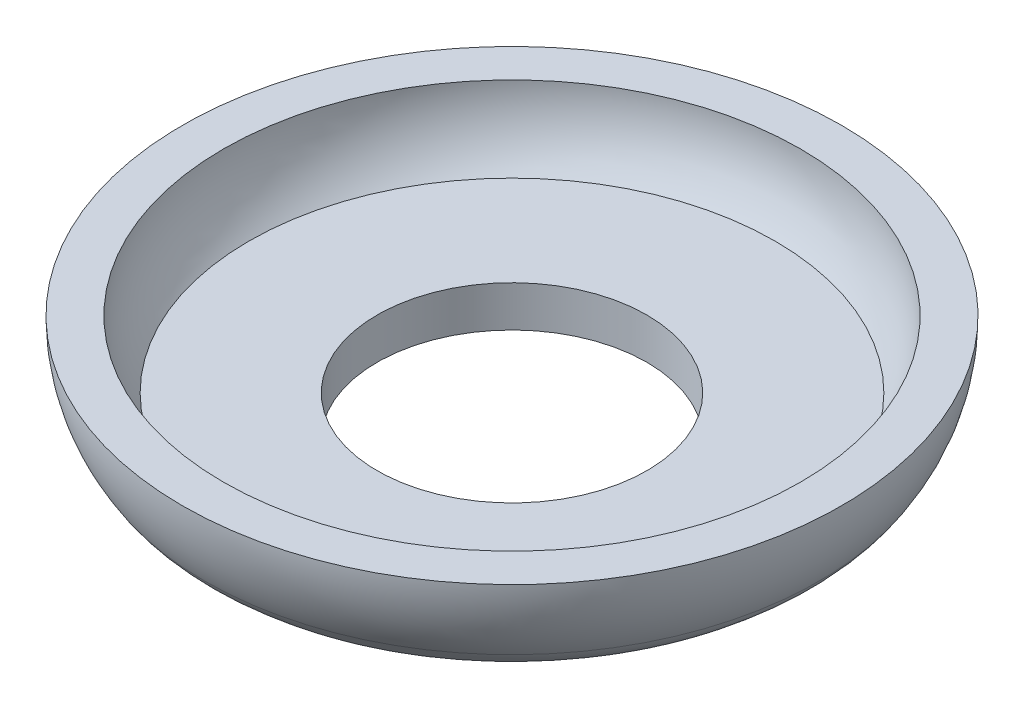
ISO-10303-21;
HEADER;
FILE_DESCRIPTION(('STEP AP214'),'2;1');
FILE_NAME('part.step','',(''),(''),'','','');
FILE_SCHEMA(('AUTOMOTIVE_DESIGN { 1 0 10303 214 1 1 1 1 }'));
ENDSEC;
DATA;
#1=APPLICATION_CONTEXT('core data for automotive mechanical design processes');
#2=APPLICATION_PROTOCOL_DEFINITION('international standard','automotive_design',2000,#1);
#3=PRODUCT_CONTEXT('',#1,'mechanical');
#4=PRODUCT('Part','Part','',(#3));
#5=PRODUCT_RELATED_PRODUCT_CATEGORY('part','',(#4));
#6=PRODUCT_DEFINITION_FORMATION('','',#4);
#7=PRODUCT_DEFINITION_CONTEXT('part definition',#1,'design');
#8=PRODUCT_DEFINITION('design','',#6,#7);
#9=PRODUCT_DEFINITION_SHAPE('','',#8);
#10=(LENGTH_UNIT() NAMED_UNIT(*) SI_UNIT(.MILLI.,.METRE.));
#11=(NAMED_UNIT(*) PLANE_ANGLE_UNIT() SI_UNIT($,.RADIAN.));
#12=(NAMED_UNIT(*) SI_UNIT($,.STERADIAN.) SOLID_ANGLE_UNIT());
#13=UNCERTAINTY_MEASURE_WITH_UNIT(LENGTH_MEASURE(1.E-05),#10,'distance_accuracy_value','');
#14=(GEOMETRIC_REPRESENTATION_CONTEXT(3) GLOBAL_UNCERTAINTY_ASSIGNED_CONTEXT((#13)) GLOBAL_UNIT_ASSIGNED_CONTEXT((#10,
#11,#12)) REPRESENTATION_CONTEXT('',''));
#15=CARTESIAN_POINT('',(0.,0.,0.));
#16=DIRECTION('',(0.,0.,1.));
#17=DIRECTION('',(1.,0.,0.));
#18=AXIS2_PLACEMENT_3D('',#15,#16,#17);
#19=CARTESIAN_POINT('',(0.,0.,0.));
#20=DIRECTION('',(0.,-1.,0.));
#21=DIRECTION('',(0.,0.,-1.));
#22=AXIS2_PLACEMENT_3D('',#19,#20,#21);
#23=CYLINDRICAL_SURFACE('',#22,5.0165);
#24=CARTESIAN_POINT('',(0.,0.,0.));
#25=DIRECTION('',(0.,-1.,0.));
#26=DIRECTION('',(0.,0.,-1.));
#27=AXIS2_PLACEMENT_3D('',#24,#25,#26);
#28=CIRCLE('',#27,5.0165);
#29=CARTESIAN_POINT('',(0.,0.,-5.0165));
#30=VERTEX_POINT('',#29);
#31=EDGE_CURVE('E10',#30,#30,#28,.T.);
#32=ORIENTED_EDGE('',*,*,#31,.T.);
#33=EDGE_LOOP('',(#32));
#34=FACE_BOUND('',#33,.T.);
#35=CARTESIAN_POINT('',(0.,1.524,0.));
#36=DIRECTION('',(0.,-1.,0.));
#37=DIRECTION('',(0.,0.,-1.));
#38=AXIS2_PLACEMENT_3D('',#35,#36,#37);
#39=CIRCLE('',#38,5.0165);
#40=CARTESIAN_POINT('',(0.,1.524,-5.0165));
#41=VERTEX_POINT('',#40);
#42=EDGE_CURVE('E57',#41,#41,#39,.T.);
#43=ORIENTED_EDGE('',*,*,#42,.F.);
#44=EDGE_LOOP('',(#43));
#45=FACE_BOUND('',#44,.T.);
#46=ADVANCED_FACE('F32',(#34,#45),#23,.F.);
#47=CARTESIAN_POINT('',(5.0165,0.,0.));
#48=DIRECTION('',(0.,-1.,0.));
#49=DIRECTION('',(0.,0.,-1.));
#50=AXIS2_PLACEMENT_3D('',#47,#48,#49);
#51=PLANE('',#50);
#52=CARTESIAN_POINT('',(0.,0.,0.));
#53=DIRECTION('',(0.,-1.,0.));
#54=DIRECTION('',(0.,0.,-1.));
#55=AXIS2_PLACEMENT_3D('',#52,#53,#54);
#56=CIRCLE('',#55,9.28063100395453);
#57=CARTESIAN_POINT('',(0.,0.,-9.28063100395453));
#58=VERTEX_POINT('',#57);
#59=EDGE_CURVE('E38',#58,#58,#56,.T.);
#60=ORIENTED_EDGE('',*,*,#59,.T.);
#61=EDGE_LOOP('',(#60));
#62=FACE_BOUND('',#61,.T.);
#63=ORIENTED_EDGE('',*,*,#31,.F.);
#64=EDGE_LOOP('',(#63));
#65=FACE_BOUND('',#64,.T.);
#66=ADVANCED_FACE('F65',(#62,#65),#51,.T.);
#67=CARTESIAN_POINT('',(0.,2.54,0.));
#68=DIRECTION('',(0.,-1.,0.));
#69=DIRECTION('',(0.,0.,-1.));
#70=AXIS2_PLACEMENT_3D('',#67,#68,#69);
#71=TOROIDAL_SURFACE('',#70,9.28063100395453,2.54);
#72=CARTESIAN_POINT('',(0.,1.16064230205049,0.));
#73=DIRECTION('',(0.,-1.,0.));
#74=DIRECTION('',(0.,0.,-1.));
#75=AXIS2_PLACEMENT_3D('',#72,#73,#74);
#76=CIRCLE('',#75,11.4134630041616);
#77=CARTESIAN_POINT('',(0.,1.16064230205049,-11.4134630041616));
#78=VERTEX_POINT('',#77);
#79=EDGE_CURVE('E42',#78,#78,#76,.T.);
#80=ORIENTED_EDGE('',*,*,#79,.T.);
#81=EDGE_LOOP('',(#80));
#82=FACE_BOUND('',#81,.T.);
#83=ORIENTED_EDGE('',*,*,#59,.F.);
#84=EDGE_LOOP('',(#83));
#85=FACE_BOUND('',#84,.T.);
#86=ADVANCED_FACE('F69',(#82,#85),#71,.T.);
#87=CARTESIAN_POINT('',(0.,4.0132,0.));
#88=DIRECTION('',(0.,-1.,0.));
#89=DIRECTION('',(0.,0.,-1.));
#90=AXIS2_PLACEMENT_3D('',#87,#88,#89);
#91=TOROIDAL_SURFACE('',#90,7.00269533333334,5.25280466666666);
#92=CARTESIAN_POINT('',(0.,4.0132,0.));
#93=DIRECTION('',(0.,-1.,0.));
#94=DIRECTION('',(0.,0.,-1.));
#95=AXIS2_PLACEMENT_3D('',#92,#93,#94);
#96=CIRCLE('',#95,12.2555);
#97=CARTESIAN_POINT('',(0.,4.0132,-12.2555));
#98=VERTEX_POINT('',#97);
#99=EDGE_CURVE('E46',#98,#98,#96,.T.);
#100=ORIENTED_EDGE('',*,*,#99,.T.);
#101=EDGE_LOOP('',(#100));
#102=FACE_BOUND('',#101,.T.);
#103=ORIENTED_EDGE('',*,*,#79,.F.);
#104=EDGE_LOOP('',(#103));
#105=FACE_BOUND('',#104,.T.);
#106=ADVANCED_FACE('F73',(#102,#105),#91,.T.);
#107=CARTESIAN_POINT('',(10.7315,4.0132,0.));
#108=DIRECTION('',(0.,1.,0.));
#109=DIRECTION('',(0.,0.,1.));
#110=AXIS2_PLACEMENT_3D('',#107,#108,#109);
#111=PLANE('',#110);
#112=CARTESIAN_POINT('',(0.,4.0132,0.));
#113=DIRECTION('',(0.,-1.,0.));
#114=DIRECTION('',(0.,0.,-1.));
#115=AXIS2_PLACEMENT_3D('',#112,#113,#114);
#116=CIRCLE('',#115,10.7315);
#117=CARTESIAN_POINT('',(0.,4.0132,-10.7315));
#118=VERTEX_POINT('',#117);
#119=EDGE_CURVE('E51',#118,#118,#116,.T.);
#120=ORIENTED_EDGE('',*,*,#119,.T.);
#121=EDGE_LOOP('',(#120));
#122=FACE_BOUND('',#121,.T.);
#123=ORIENTED_EDGE('',*,*,#99,.F.);
#124=EDGE_LOOP('',(#123));
#125=FACE_BOUND('',#124,.T.);
#126=ADVANCED_FACE('F80',(#122,#125),#111,.T.);
#127=CARTESIAN_POINT('',(0.,4.0132,0.));
#128=DIRECTION('',(0.,-1.,0.));
#129=DIRECTION('',(0.,0.,-1.));
#130=AXIS2_PLACEMENT_3D('',#127,#128,#129);
#131=TOROIDAL_SURFACE('',#130,7.00269533333334,3.72880466666666);
#132=CARTESIAN_POINT('',(0.,1.524,0.));
#133=DIRECTION('',(0.,-1.,0.));
#134=DIRECTION('',(0.,0.,-1.));
#135=AXIS2_PLACEMENT_3D('',#132,#133,#134);
#136=CIRCLE('',#135,9.779);
#137=CARTESIAN_POINT('',(0.,1.524,-9.779));
#138=VERTEX_POINT('',#137);
#139=EDGE_CURVE('E54',#138,#138,#136,.T.);
#140=ORIENTED_EDGE('',*,*,#139,.T.);
#141=EDGE_LOOP('',(#140));
#142=FACE_BOUND('',#141,.T.);
#143=ORIENTED_EDGE('',*,*,#119,.F.);
#144=EDGE_LOOP('',(#143));
#145=FACE_BOUND('',#144,.T.);
#146=ADVANCED_FACE('F84',(#142,#145),#131,.F.);
#147=CARTESIAN_POINT('',(5.0165,1.524,0.));
#148=DIRECTION('',(0.,1.,0.));
#149=DIRECTION('',(0.,0.,1.));
#150=AXIS2_PLACEMENT_3D('',#147,#148,#149);
#151=PLANE('',#150);
#152=ORIENTED_EDGE('',*,*,#42,.T.);
#153=EDGE_LOOP('',(#152));
#154=FACE_BOUND('',#153,.T.);
#155=ORIENTED_EDGE('',*,*,#139,.F.);
#156=EDGE_LOOP('',(#155));
#157=FACE_BOUND('',#156,.T.);
#158=ADVANCED_FACE('F61',(#154,#157),#151,.T.);
#159=CLOSED_SHELL('',(#46,#66,#86,#106,#126,#146,#158));
#160=MANIFOLD_SOLID_BREP('B2',#159);
#161=ADVANCED_BREP_SHAPE_REPRESENTATION('',(#18,#160),#14);
#162=SHAPE_DEFINITION_REPRESENTATION(#9,#161);
ENDSEC;
END-ISO-10303-21;
